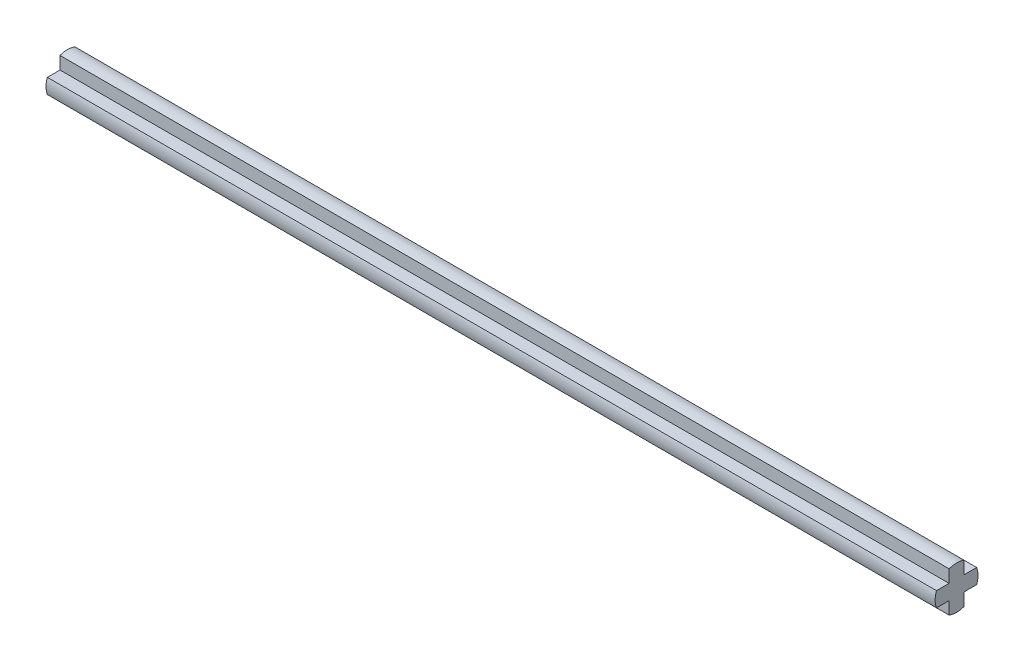
ISO-10303-21;
HEADER;
FILE_DESCRIPTION(('STEP AP214'),'2;1');
FILE_NAME('part.step','',(''),(''),'','','');
FILE_SCHEMA(('AUTOMOTIVE_DESIGN { 1 0 10303 214 1 1 1 1 }'));
ENDSEC;
DATA;
#1=APPLICATION_CONTEXT('core data for automotive mechanical design processes');
#2=APPLICATION_PROTOCOL_DEFINITION('international standard','automotive_design',2000,#1);
#3=PRODUCT_CONTEXT('',#1,'mechanical');
#4=PRODUCT('Part','Part','',(#3));
#5=PRODUCT_RELATED_PRODUCT_CATEGORY('part','',(#4));
#6=PRODUCT_DEFINITION_FORMATION('','',#4);
#7=PRODUCT_DEFINITION_CONTEXT('part definition',#1,'design');
#8=PRODUCT_DEFINITION('design','',#6,#7);
#9=PRODUCT_DEFINITION_SHAPE('','',#8);
#10=(LENGTH_UNIT() NAMED_UNIT(*) SI_UNIT(.MILLI.,.METRE.));
#11=(NAMED_UNIT(*) PLANE_ANGLE_UNIT() SI_UNIT($,.RADIAN.));
#12=(NAMED_UNIT(*) SI_UNIT($,.STERADIAN.) SOLID_ANGLE_UNIT());
#13=UNCERTAINTY_MEASURE_WITH_UNIT(LENGTH_MEASURE(1.E-05),#10,'distance_accuracy_value','');
#14=(GEOMETRIC_REPRESENTATION_CONTEXT(3) GLOBAL_UNCERTAINTY_ASSIGNED_CONTEXT((#13)) GLOBAL_UNIT_ASSIGNED_CONTEXT((#10,
#11,#12)) REPRESENTATION_CONTEXT('',''));
#15=CARTESIAN_POINT('',(0.,0.,0.));
#16=DIRECTION('',(0.,0.,1.));
#17=DIRECTION('',(1.,0.,0.));
#18=AXIS2_PLACEMENT_3D('',#15,#16,#17);
#19=CARTESIAN_POINT('',(95.4,0.8,2.15638586528478));
#20=CARTESIAN_POINT('',(95.4,0.,2.44361413471522));
#21=CARTESIAN_POINT('',(95.4,-0.8,2.15638586528478));
#22=B_SPLINE_CURVE_WITH_KNOTS('',2,(#19,#20,#21),.UNSPECIFIED.,.F.,.F.,(3,3),(0.,1.),.UNSPECIFIED.);
#23=DIRECTION('',(-1.,0.,0.));
#24=VECTOR('',#23,1.);
#25=SURFACE_OF_LINEAR_EXTRUSION('',#22,#24);
#26=CARTESIAN_POINT('',(0.,0.8,2.15638586528478));
#27=CARTESIAN_POINT('',(0.,0.,2.44361413471522));
#28=CARTESIAN_POINT('',(0.,-0.8,2.15638586528478));
#29=B_SPLINE_CURVE_WITH_KNOTS('',2,(#26,#27,#28),.UNSPECIFIED.,.F.,.F.,(3,3),(0.,1.),.UNSPECIFIED.);
#30=CARTESIAN_POINT('',(0.,0.8,2.15638586528478));
#31=VERTEX_POINT('',#30);
#32=CARTESIAN_POINT('',(0.,-0.8,2.15638586528478));
#33=VERTEX_POINT('',#32);
#34=EDGE_CURVE('E157',#31,#33,#29,.T.);
#35=ORIENTED_EDGE('',*,*,#34,.T.);
#36=DIRECTION('',(-1.,0.,0.));
#37=VECTOR('',#36,1.);
#38=CARTESIAN_POINT('',(95.4,-0.8,2.15638586528478));
#39=LINE('',#38,#37);
#40=CARTESIAN_POINT('',(95.4,-0.8,2.15638586528478));
#41=VERTEX_POINT('',#40);
#42=EDGE_CURVE('E11',#41,#33,#39,.T.);
#43=ORIENTED_EDGE('',*,*,#42,.F.);
#44=CARTESIAN_POINT('',(95.4,0.8,2.15638586528478));
#45=VERTEX_POINT('',#44);
#46=EDGE_CURVE('E199',#45,#41,#22,.T.);
#47=ORIENTED_EDGE('',*,*,#46,.F.);
#48=DIRECTION('',(-1.,0.,0.));
#49=VECTOR('',#48,1.);
#50=CARTESIAN_POINT('',(95.4,0.8,2.15638586528478));
#51=LINE('',#50,#49);
#52=EDGE_CURVE('E150',#45,#31,#51,.T.);
#53=ORIENTED_EDGE('',*,*,#52,.T.);
#54=EDGE_LOOP('',(#35,#43,#47,#53));
#55=FACE_BOUND('',#54,.T.);
#56=ADVANCED_FACE('F33',(#55),#25,.F.);
#57=CARTESIAN_POINT('',(95.4,-0.8,0.8));
#58=DIRECTION('',(0.,1.,0.));
#59=DIRECTION('',(0.,0.,1.));
#60=AXIS2_PLACEMENT_3D('',#57,#58,#59);
#61=PLANE('',#60);
#62=DIRECTION('',(0.,0.,-1.));
#63=VECTOR('',#62,1.);
#64=CARTESIAN_POINT('',(0.,-0.8,0.8));
#65=LINE('',#64,#63);
#66=CARTESIAN_POINT('',(0.,-0.8,0.8));
#67=VERTEX_POINT('',#66);
#68=EDGE_CURVE('E162',#33,#67,#65,.T.);
#69=ORIENTED_EDGE('',*,*,#68,.T.);
#70=DIRECTION('',(-1.,0.,0.));
#71=VECTOR('',#70,1.);
#72=CARTESIAN_POINT('',(95.4,-0.8,0.8));
#73=LINE('',#72,#71);
#74=CARTESIAN_POINT('',(95.4,-0.8,0.8));
#75=VERTEX_POINT('',#74);
#76=EDGE_CURVE('E42',#75,#67,#73,.T.);
#77=ORIENTED_EDGE('',*,*,#76,.F.);
#78=DIRECTION('',(0.,0.,-1.));
#79=VECTOR('',#78,1.);
#80=CARTESIAN_POINT('',(95.4,-0.8,0.8));
#81=LINE('',#80,#79);
#82=EDGE_CURVE('E105',#41,#75,#81,.T.);
#83=ORIENTED_EDGE('',*,*,#82,.F.);
#84=ORIENTED_EDGE('',*,*,#42,.T.);
#85=EDGE_LOOP('',(#69,#77,#83,#84));
#86=FACE_BOUND('',#85,.T.);
#87=ADVANCED_FACE('F279',(#86),#61,.F.);
#88=CARTESIAN_POINT('',(95.4,-2.15638586528478,0.8));
#89=DIRECTION('',(0.,0.,-1.));
#90=DIRECTION('',(-1.,0.,0.));
#91=AXIS2_PLACEMENT_3D('',#88,#89,#90);
#92=PLANE('',#91);
#93=DIRECTION('',(0.,-1.,0.));
#94=VECTOR('',#93,1.);
#95=CARTESIAN_POINT('',(0.,-2.15638586528478,0.8));
#96=LINE('',#95,#94);
#97=CARTESIAN_POINT('',(0.,-2.15638586528478,0.8));
#98=VERTEX_POINT('',#97);
#99=EDGE_CURVE('E167',#67,#98,#96,.T.);
#100=ORIENTED_EDGE('',*,*,#99,.T.);
#101=DIRECTION('',(-1.,0.,0.));
#102=VECTOR('',#101,1.);
#103=CARTESIAN_POINT('',(95.4,-2.15638586528478,0.8));
#104=LINE('',#103,#102);
#105=CARTESIAN_POINT('',(95.4,-2.15638586528478,0.8));
#106=VERTEX_POINT('',#105);
#107=EDGE_CURVE('E218',#106,#98,#104,.T.);
#108=ORIENTED_EDGE('',*,*,#107,.F.);
#109=DIRECTION('',(0.,-1.,0.));
#110=VECTOR('',#109,1.);
#111=CARTESIAN_POINT('',(95.4,-2.15638586528478,0.8));
#112=LINE('',#111,#110);
#113=EDGE_CURVE('E226',#75,#106,#112,.T.);
#114=ORIENTED_EDGE('',*,*,#113,.F.);
#115=ORIENTED_EDGE('',*,*,#76,.T.);
#116=EDGE_LOOP('',(#100,#108,#114,#115));
#117=FACE_BOUND('',#116,.T.);
#118=ADVANCED_FACE('F224',(#117),#92,.F.);
#119=CARTESIAN_POINT('',(95.4,-2.15638586528478,0.8));
#120=CARTESIAN_POINT('',(95.4,-2.44361413471522,0.));
#121=CARTESIAN_POINT('',(95.4,-2.15638586528478,-0.8));
#122=B_SPLINE_CURVE_WITH_KNOTS('',2,(#119,#120,#121),.UNSPECIFIED.,.F.,.F.,(3,3),(0.,1.),.UNSPECIFIED.);
#123=DIRECTION('',(-1.,0.,0.));
#124=VECTOR('',#123,1.);
#125=SURFACE_OF_LINEAR_EXTRUSION('',#122,#124);
#126=CARTESIAN_POINT('',(0.,-2.15638586528478,0.8));
#127=CARTESIAN_POINT('',(0.,-2.44361413471522,0.));
#128=CARTESIAN_POINT('',(0.,-2.15638586528478,-0.8));
#129=B_SPLINE_CURVE_WITH_KNOTS('',2,(#126,#127,#128),.UNSPECIFIED.,.F.,.F.,(3,3),(0.,1.),.UNSPECIFIED.);
#130=CARTESIAN_POINT('',(0.,-2.15638586528478,-0.8));
#131=VERTEX_POINT('',#130);
#132=EDGE_CURVE('E169',#98,#131,#129,.T.);
#133=ORIENTED_EDGE('',*,*,#132,.T.);
#134=DIRECTION('',(-1.,0.,0.));
#135=VECTOR('',#134,1.);
#136=CARTESIAN_POINT('',(95.4,-2.15638586528478,-0.8));
#137=LINE('',#136,#135);
#138=CARTESIAN_POINT('',(95.4,-2.15638586528478,-0.8));
#139=VERTEX_POINT('',#138);
#140=EDGE_CURVE('E215',#139,#131,#137,.T.);
#141=ORIENTED_EDGE('',*,*,#140,.F.);
#142=EDGE_CURVE('E244',#106,#139,#122,.T.);
#143=ORIENTED_EDGE('',*,*,#142,.F.);
#144=ORIENTED_EDGE('',*,*,#107,.T.);
#145=EDGE_LOOP('',(#133,#141,#143,#144));
#146=FACE_BOUND('',#145,.T.);
#147=ADVANCED_FACE('F235',(#146),#125,.F.);
#148=CARTESIAN_POINT('',(95.4,-0.8,-0.8));
#149=DIRECTION('',(0.,0.,1.));
#150=DIRECTION('',(0.,-1.,0.));
#151=AXIS2_PLACEMENT_3D('',#148,#149,#150);
#152=PLANE('',#151);
#153=DIRECTION('',(0.,1.,0.));
#154=VECTOR('',#153,1.);
#155=CARTESIAN_POINT('',(0.,-0.8,-0.8));
#156=LINE('',#155,#154);
#157=CARTESIAN_POINT('',(0.,-0.8,-0.8));
#158=VERTEX_POINT('',#157);
#159=EDGE_CURVE('E173',#131,#158,#156,.T.);
#160=ORIENTED_EDGE('',*,*,#159,.T.);
#161=DIRECTION('',(-1.,0.,0.));
#162=VECTOR('',#161,1.);
#163=CARTESIAN_POINT('',(95.4,-0.8,-0.8));
#164=LINE('',#163,#162);
#165=CARTESIAN_POINT('',(95.4,-0.8,-0.8));
#166=VERTEX_POINT('',#165);
#167=EDGE_CURVE('E212',#166,#158,#164,.T.);
#168=ORIENTED_EDGE('',*,*,#167,.F.);
#169=DIRECTION('',(0.,1.,0.));
#170=VECTOR('',#169,1.);
#171=CARTESIAN_POINT('',(95.4,-0.8,-0.8));
#172=LINE('',#171,#170);
#173=EDGE_CURVE('E241',#139,#166,#172,.T.);
#174=ORIENTED_EDGE('',*,*,#173,.F.);
#175=ORIENTED_EDGE('',*,*,#140,.T.);
#176=EDGE_LOOP('',(#160,#168,#174,#175));
#177=FACE_BOUND('',#176,.T.);
#178=ADVANCED_FACE('F239',(#177),#152,.F.);
#179=CARTESIAN_POINT('',(95.4,-0.8,-2.15638586528478));
#180=DIRECTION('',(0.,1.,0.));
#181=DIRECTION('',(0.,0.,1.));
#182=AXIS2_PLACEMENT_3D('',#179,#180,#181);
#183=PLANE('',#182);
#184=DIRECTION('',(0.,0.,-1.));
#185=VECTOR('',#184,1.);
#186=CARTESIAN_POINT('',(0.,-0.8,-2.15638586528478));
#187=LINE('',#186,#185);
#188=CARTESIAN_POINT('',(0.,-0.8,-2.15638586528478));
#189=VERTEX_POINT('',#188);
#190=EDGE_CURVE('E178',#158,#189,#187,.T.);
#191=ORIENTED_EDGE('',*,*,#190,.T.);
#192=DIRECTION('',(-1.,0.,0.));
#193=VECTOR('',#192,1.);
#194=CARTESIAN_POINT('',(95.4,-0.8,-2.15638586528478));
#195=LINE('',#194,#193);
#196=CARTESIAN_POINT('',(95.4,-0.8,-2.15638586528478));
#197=VERTEX_POINT('',#196);
#198=EDGE_CURVE('E209',#197,#189,#195,.T.);
#199=ORIENTED_EDGE('',*,*,#198,.F.);
#200=DIRECTION('',(0.,0.,-1.));
#201=VECTOR('',#200,1.);
#202=CARTESIAN_POINT('',(95.4,-0.8,-2.15638586528478));
#203=LINE('',#202,#201);
#204=EDGE_CURVE('E243',#166,#197,#203,.T.);
#205=ORIENTED_EDGE('',*,*,#204,.F.);
#206=ORIENTED_EDGE('',*,*,#167,.T.);
#207=EDGE_LOOP('',(#191,#199,#205,#206));
#208=FACE_BOUND('',#207,.T.);
#209=ADVANCED_FACE('F268',(#208),#183,.F.);
#210=CARTESIAN_POINT('',(95.4,-0.8,-2.15638586528478));
#211=CARTESIAN_POINT('',(95.4,0.,-2.44361413471522));
#212=CARTESIAN_POINT('',(95.4,0.8,-2.15638586528478));
#213=B_SPLINE_CURVE_WITH_KNOTS('',2,(#210,#211,#212),.UNSPECIFIED.,.F.,.F.,(3,3),(0.,1.),.UNSPECIFIED.);
#214=DIRECTION('',(-1.,0.,0.));
#215=VECTOR('',#214,1.);
#216=SURFACE_OF_LINEAR_EXTRUSION('',#213,#215);
#217=CARTESIAN_POINT('',(0.,-0.8,-2.15638586528478));
#218=CARTESIAN_POINT('',(0.,0.,-2.44361413471522));
#219=CARTESIAN_POINT('',(0.,0.8,-2.15638586528478));
#220=B_SPLINE_CURVE_WITH_KNOTS('',2,(#217,#218,#219),.UNSPECIFIED.,.F.,.F.,(3,3),(0.,1.),.UNSPECIFIED.);
#221=CARTESIAN_POINT('',(0.,0.8,-2.15638586528478));
#222=VERTEX_POINT('',#221);
#223=EDGE_CURVE('E180',#189,#222,#220,.T.);
#224=ORIENTED_EDGE('',*,*,#223,.T.);
#225=DIRECTION('',(-1.,0.,0.));
#226=VECTOR('',#225,1.);
#227=CARTESIAN_POINT('',(95.4,0.8,-2.15638586528478));
#228=LINE('',#227,#226);
#229=CARTESIAN_POINT('',(95.4,0.8,-2.15638586528478));
#230=VERTEX_POINT('',#229);
#231=EDGE_CURVE('E206',#230,#222,#228,.T.);
#232=ORIENTED_EDGE('',*,*,#231,.F.);
#233=EDGE_CURVE('E246',#197,#230,#213,.T.);
#234=ORIENTED_EDGE('',*,*,#233,.F.);
#235=ORIENTED_EDGE('',*,*,#198,.T.);
#236=EDGE_LOOP('',(#224,#232,#234,#235));
#237=FACE_BOUND('',#236,.T.);
#238=ADVANCED_FACE('F263',(#237),#216,.F.);
#239=CARTESIAN_POINT('',(95.4,0.8,-0.8));
#240=DIRECTION('',(0.,-1.,0.));
#241=DIRECTION('',(0.,0.,-1.));
#242=AXIS2_PLACEMENT_3D('',#239,#240,#241);
#243=PLANE('',#242);
#244=DIRECTION('',(0.,0.,1.));
#245=VECTOR('',#244,1.);
#246=CARTESIAN_POINT('',(0.,0.8,-0.8));
#247=LINE('',#246,#245);
#248=CARTESIAN_POINT('',(0.,0.8,-0.8));
#249=VERTEX_POINT('',#248);
#250=EDGE_CURVE('E184',#222,#249,#247,.T.);
#251=ORIENTED_EDGE('',*,*,#250,.T.);
#252=DIRECTION('',(-1.,0.,0.));
#253=VECTOR('',#252,1.);
#254=CARTESIAN_POINT('',(95.4,0.8,-0.8));
#255=LINE('',#254,#253);
#256=CARTESIAN_POINT('',(95.4,0.8,-0.8));
#257=VERTEX_POINT('',#256);
#258=EDGE_CURVE('E203',#257,#249,#255,.T.);
#259=ORIENTED_EDGE('',*,*,#258,.F.);
#260=DIRECTION('',(0.,0.,1.));
#261=VECTOR('',#260,1.);
#262=CARTESIAN_POINT('',(95.4,0.8,-0.8));
#263=LINE('',#262,#261);
#264=EDGE_CURVE('E258',#230,#257,#263,.T.);
#265=ORIENTED_EDGE('',*,*,#264,.F.);
#266=ORIENTED_EDGE('',*,*,#231,.T.);
#267=EDGE_LOOP('',(#251,#259,#265,#266));
#268=FACE_BOUND('',#267,.T.);
#269=ADVANCED_FACE('F267',(#268),#243,.F.);
#270=CARTESIAN_POINT('',(95.4,2.15638586528478,-0.8));
#271=DIRECTION('',(0.,0.,1.));
#272=DIRECTION('',(1.,0.,0.));
#273=AXIS2_PLACEMENT_3D('',#270,#271,#272);
#274=PLANE('',#273);
#275=DIRECTION('',(0.,1.,0.));
#276=VECTOR('',#275,1.);
#277=CARTESIAN_POINT('',(0.,2.15638586528478,-0.8));
#278=LINE('',#277,#276);
#279=CARTESIAN_POINT('',(0.,2.15638586528478,-0.8));
#280=VERTEX_POINT('',#279);
#281=EDGE_CURVE('E189',#249,#280,#278,.T.);
#282=ORIENTED_EDGE('',*,*,#281,.T.);
#283=DIRECTION('',(-1.,0.,0.));
#284=VECTOR('',#283,1.);
#285=CARTESIAN_POINT('',(95.4,2.15638586528478,-0.8));
#286=LINE('',#285,#284);
#287=CARTESIAN_POINT('',(95.4,2.15638586528478,-0.8));
#288=VERTEX_POINT('',#287);
#289=EDGE_CURVE('E145',#288,#280,#286,.T.);
#290=ORIENTED_EDGE('',*,*,#289,.F.);
#291=DIRECTION('',(0.,1.,0.));
#292=VECTOR('',#291,1.);
#293=CARTESIAN_POINT('',(95.4,2.15638586528478,-0.8));
#294=LINE('',#293,#292);
#295=EDGE_CURVE('E136',#257,#288,#294,.T.);
#296=ORIENTED_EDGE('',*,*,#295,.F.);
#297=ORIENTED_EDGE('',*,*,#258,.T.);
#298=EDGE_LOOP('',(#282,#290,#296,#297));
#299=FACE_BOUND('',#298,.T.);
#300=ADVANCED_FACE('F291',(#299),#274,.F.);
#301=CARTESIAN_POINT('',(95.4,2.15638586528478,-0.8));
#302=CARTESIAN_POINT('',(95.4,2.44361413471522,0.));
#303=CARTESIAN_POINT('',(95.4,2.15638586528478,0.8));
#304=B_SPLINE_CURVE_WITH_KNOTS('',2,(#301,#302,#303),.UNSPECIFIED.,.F.,.F.,(3,3),(0.,1.),.UNSPECIFIED.);
#305=DIRECTION('',(-1.,0.,0.));
#306=VECTOR('',#305,1.);
#307=SURFACE_OF_LINEAR_EXTRUSION('',#304,#306);
#308=CARTESIAN_POINT('',(0.,2.15638586528478,-0.8));
#309=CARTESIAN_POINT('',(0.,2.44361413471522,0.));
#310=CARTESIAN_POINT('',(0.,2.15638586528478,0.8));
#311=B_SPLINE_CURVE_WITH_KNOTS('',2,(#308,#309,#310),.UNSPECIFIED.,.F.,.F.,(3,3),(0.,1.),.UNSPECIFIED.);
#312=CARTESIAN_POINT('',(0.,2.15638586528478,0.8));
#313=VERTEX_POINT('',#312);
#314=EDGE_CURVE('E144',#280,#313,#311,.T.);
#315=ORIENTED_EDGE('',*,*,#314,.T.);
#316=DIRECTION('',(-1.,0.,0.));
#317=VECTOR('',#316,1.);
#318=CARTESIAN_POINT('',(95.4,2.15638586528478,0.8));
#319=LINE('',#318,#317);
#320=CARTESIAN_POINT('',(95.4,2.15638586528478,0.8));
#321=VERTEX_POINT('',#320);
#322=EDGE_CURVE('E141',#321,#313,#319,.T.);
#323=ORIENTED_EDGE('',*,*,#322,.F.);
#324=EDGE_CURVE('E130',#288,#321,#304,.T.);
#325=ORIENTED_EDGE('',*,*,#324,.F.);
#326=ORIENTED_EDGE('',*,*,#289,.T.);
#327=EDGE_LOOP('',(#315,#323,#325,#326));
#328=FACE_BOUND('',#327,.T.);
#329=ADVANCED_FACE('F142',(#328),#307,.F.);
#330=CARTESIAN_POINT('',(95.4,0.8,0.8));
#331=DIRECTION('',(0.,0.,-1.));
#332=DIRECTION('',(-1.,0.,0.));
#333=AXIS2_PLACEMENT_3D('',#330,#331,#332);
#334=PLANE('',#333);
#335=DIRECTION('',(0.,-1.,0.));
#336=VECTOR('',#335,1.);
#337=CARTESIAN_POINT('',(0.,0.8,0.8));
#338=LINE('',#337,#336);
#339=CARTESIAN_POINT('',(0.,0.8,0.8));
#340=VERTEX_POINT('',#339);
#341=EDGE_CURVE('E91',#313,#340,#338,.T.);
#342=ORIENTED_EDGE('',*,*,#341,.T.);
#343=DIRECTION('',(-1.,0.,0.));
#344=VECTOR('',#343,1.);
#345=CARTESIAN_POINT('',(95.4,0.8,0.8));
#346=LINE('',#345,#344);
#347=CARTESIAN_POINT('',(95.4,0.8,0.8));
#348=VERTEX_POINT('',#347);
#349=EDGE_CURVE('E146',#348,#340,#346,.T.);
#350=ORIENTED_EDGE('',*,*,#349,.F.);
#351=DIRECTION('',(0.,-1.,0.));
#352=VECTOR('',#351,1.);
#353=CARTESIAN_POINT('',(95.4,0.8,0.8));
#354=LINE('',#353,#352);
#355=EDGE_CURVE('E134',#321,#348,#354,.T.);
#356=ORIENTED_EDGE('',*,*,#355,.F.);
#357=ORIENTED_EDGE('',*,*,#322,.T.);
#358=EDGE_LOOP('',(#342,#350,#356,#357));
#359=FACE_BOUND('',#358,.T.);
#360=ADVANCED_FACE('F148',(#359),#334,.F.);
#361=CARTESIAN_POINT('',(95.4,0.8,2.15638586528478));
#362=DIRECTION('',(0.,-1.,0.));
#363=DIRECTION('',(0.,0.,-1.));
#364=AXIS2_PLACEMENT_3D('',#361,#362,#363);
#365=PLANE('',#364);
#366=DIRECTION('',(0.,0.,1.));
#367=VECTOR('',#366,1.);
#368=CARTESIAN_POINT('',(0.,0.8,2.15638586528478));
#369=LINE('',#368,#367);
#370=EDGE_CURVE('E97',#340,#31,#369,.T.);
#371=ORIENTED_EDGE('',*,*,#370,.T.);
#372=ORIENTED_EDGE('',*,*,#52,.F.);
#373=DIRECTION('',(0.,0.,1.));
#374=VECTOR('',#373,1.);
#375=CARTESIAN_POINT('',(95.4,0.8,2.15638586528478));
#376=LINE('',#375,#374);
#377=EDGE_CURVE('E50',#348,#45,#376,.T.);
#378=ORIENTED_EDGE('',*,*,#377,.F.);
#379=ORIENTED_EDGE('',*,*,#349,.T.);
#380=EDGE_LOOP('',(#371,#372,#378,#379));
#381=FACE_BOUND('',#380,.T.);
#382=ADVANCED_FACE('F309',(#381),#365,.F.);
#383=CARTESIAN_POINT('',(95.4,0.,2.3));
#384=DIRECTION('',(1.,0.,0.));
#385=DIRECTION('',(0.,0.,-1.));
#386=AXIS2_PLACEMENT_3D('',#383,#384,#385);
#387=PLANE('',#386);
#388=ORIENTED_EDGE('',*,*,#46,.T.);
#389=ORIENTED_EDGE('',*,*,#82,.T.);
#390=ORIENTED_EDGE('',*,*,#113,.T.);
#391=ORIENTED_EDGE('',*,*,#142,.T.);
#392=ORIENTED_EDGE('',*,*,#173,.T.);
#393=ORIENTED_EDGE('',*,*,#204,.T.);
#394=ORIENTED_EDGE('',*,*,#233,.T.);
#395=ORIENTED_EDGE('',*,*,#264,.T.);
#396=ORIENTED_EDGE('',*,*,#295,.T.);
#397=ORIENTED_EDGE('',*,*,#324,.T.);
#398=ORIENTED_EDGE('',*,*,#355,.T.);
#399=ORIENTED_EDGE('',*,*,#377,.T.);
#400=EDGE_LOOP('',(#388,#389,#390,#391,#392,#393,#394,#395,#396,#397,#398,#399));
#401=FACE_BOUND('',#400,.T.);
#402=ADVANCED_FACE('F132',(#401),#387,.T.);
#403=CARTESIAN_POINT('',(0.,0.,2.3));
#404=DIRECTION('',(1.,0.,0.));
#405=DIRECTION('',(0.,0.,-1.));
#406=AXIS2_PLACEMENT_3D('',#403,#404,#405);
#407=PLANE('',#406);
#408=ORIENTED_EDGE('',*,*,#34,.F.);
#409=ORIENTED_EDGE('',*,*,#370,.F.);
#410=ORIENTED_EDGE('',*,*,#341,.F.);
#411=ORIENTED_EDGE('',*,*,#314,.F.);
#412=ORIENTED_EDGE('',*,*,#281,.F.);
#413=ORIENTED_EDGE('',*,*,#250,.F.);
#414=ORIENTED_EDGE('',*,*,#223,.F.);
#415=ORIENTED_EDGE('',*,*,#190,.F.);
#416=ORIENTED_EDGE('',*,*,#159,.F.);
#417=ORIENTED_EDGE('',*,*,#132,.F.);
#418=ORIENTED_EDGE('',*,*,#99,.F.);
#419=ORIENTED_EDGE('',*,*,#68,.F.);
#420=EDGE_LOOP('',(#408,#409,#410,#411,#412,#413,#414,#415,#416,#417,#418,#419));
#421=FACE_BOUND('',#420,.T.);
#422=ADVANCED_FACE('F230',(#421),#407,.F.);
#423=CLOSED_SHELL('',(#56,#87,#118,#147,#178,#209,#238,#269,#300,#329,#360,#382,#402,#422));
#424=MANIFOLD_SOLID_BREP('B2',#423);
#425=ADVANCED_BREP_SHAPE_REPRESENTATION('',(#18,#424),#14);
#426=SHAPE_DEFINITION_REPRESENTATION(#9,#425);
ENDSEC;
END-ISO-10303-21;
